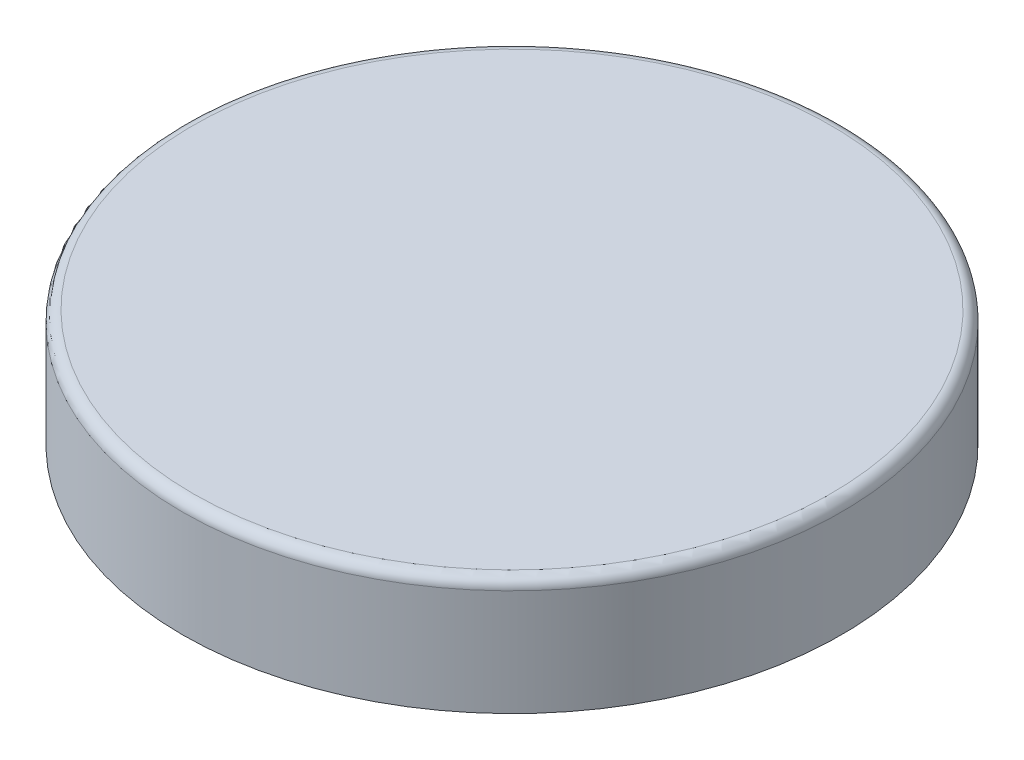
ISO-10303-21;
HEADER;
FILE_DESCRIPTION(('STEP AP214'),'2;1');
FILE_NAME('part.step','',(''),(''),'','','');
FILE_SCHEMA(('AUTOMOTIVE_DESIGN { 1 0 10303 214 1 1 1 1 }'));
ENDSEC;
DATA;
#1=APPLICATION_CONTEXT('core data for automotive mechanical design processes');
#2=APPLICATION_PROTOCOL_DEFINITION('international standard','automotive_design',2000,#1);
#3=PRODUCT_CONTEXT('',#1,'mechanical');
#4=PRODUCT('Part','Part','',(#3));
#5=PRODUCT_RELATED_PRODUCT_CATEGORY('part','',(#4));
#6=PRODUCT_DEFINITION_FORMATION('','',#4);
#7=PRODUCT_DEFINITION_CONTEXT('part definition',#1,'design');
#8=PRODUCT_DEFINITION('design','',#6,#7);
#9=PRODUCT_DEFINITION_SHAPE('','',#8);
#10=(LENGTH_UNIT() NAMED_UNIT(*) SI_UNIT(.MILLI.,.METRE.));
#11=(NAMED_UNIT(*) PLANE_ANGLE_UNIT() SI_UNIT($,.RADIAN.));
#12=(NAMED_UNIT(*) SI_UNIT($,.STERADIAN.) SOLID_ANGLE_UNIT());
#13=UNCERTAINTY_MEASURE_WITH_UNIT(LENGTH_MEASURE(1.E-05),#10,'distance_accuracy_value','');
#14=(GEOMETRIC_REPRESENTATION_CONTEXT(3) GLOBAL_UNCERTAINTY_ASSIGNED_CONTEXT((#13)) GLOBAL_UNIT_ASSIGNED_CONTEXT((#10,
#11,#12)) REPRESENTATION_CONTEXT('',''));
#15=CARTESIAN_POINT('',(0.,0.,0.));
#16=DIRECTION('',(0.,0.,1.));
#17=DIRECTION('',(1.,0.,0.));
#18=AXIS2_PLACEMENT_3D('',#15,#16,#17);
#19=CARTESIAN_POINT('',(0.,0.,0.));
#20=DIRECTION('',(0.,1.,0.));
#21=DIRECTION('',(0.,0.,1.));
#22=AXIS2_PLACEMENT_3D('',#19,#20,#21);
#23=PLANE('',#22);
#24=CARTESIAN_POINT('',(0.,0.,0.));
#25=DIRECTION('',(0.,1.,0.));
#26=DIRECTION('',(0.,0.,1.));
#27=AXIS2_PLACEMENT_3D('',#24,#25,#26);
#28=CIRCLE('',#27,31.);
#29=CARTESIAN_POINT('',(0.,0.,31.));
#30=VERTEX_POINT('',#29);
#31=EDGE_CURVE('E41',#30,#30,#28,.T.);
#32=ORIENTED_EDGE('',*,*,#31,.F.);
#33=EDGE_LOOP('',(#32));
#34=FACE_BOUND('',#33,.T.);
#35=CARTESIAN_POINT('',(0.,0.,0.));
#36=DIRECTION('',(0.,1.,0.));
#37=DIRECTION('',(0.,0.,1.));
#38=AXIS2_PLACEMENT_3D('',#35,#36,#37);
#39=CIRCLE('',#38,30.);
#40=CARTESIAN_POINT('',(0.,0.,30.));
#41=VERTEX_POINT('',#40);
#42=EDGE_CURVE('E45',#41,#41,#39,.T.);
#43=ORIENTED_EDGE('',*,*,#42,.T.);
#44=EDGE_LOOP('',(#43));
#45=FACE_BOUND('',#44,.T.);
#46=ADVANCED_FACE('F30',(#34,#45),#23,.F.);
#47=CARTESIAN_POINT('',(0.,10.,0.));
#48=DIRECTION('',(0.,-1.,0.));
#49=DIRECTION('',(0.,0.,-1.));
#50=AXIS2_PLACEMENT_3D('',#47,#48,#49);
#51=CYLINDRICAL_SURFACE('',#50,31.);
#52=CARTESIAN_POINT('',(0.,10.,0.));
#53=DIRECTION('',(0.,1.,0.));
#54=DIRECTION('',(0.,0.,1.));
#55=AXIS2_PLACEMENT_3D('',#52,#53,#54);
#56=CIRCLE('',#55,31.);
#57=CARTESIAN_POINT('',(0.,10.,31.));
#58=VERTEX_POINT('',#57);
#59=EDGE_CURVE('E10',#58,#58,#56,.F.);
#60=ORIENTED_EDGE('',*,*,#59,.T.);
#61=EDGE_LOOP('',(#60));
#62=FACE_BOUND('',#61,.T.);
#63=ORIENTED_EDGE('',*,*,#31,.T.);
#64=EDGE_LOOP('',(#63));
#65=FACE_BOUND('',#64,.T.);
#66=ADVANCED_FACE('F66',(#62,#65),#51,.T.);
#67=CARTESIAN_POINT('',(0.,10.,0.));
#68=DIRECTION('',(0.,-1.,0.));
#69=DIRECTION('',(0.,0.,-1.));
#70=AXIS2_PLACEMENT_3D('',#67,#68,#69);
#71=CYLINDRICAL_SURFACE('',#70,30.);
#72=CARTESIAN_POINT('',(0.,10.,0.));
#73=DIRECTION('',(0.,1.,0.));
#74=DIRECTION('',(0.,0.,1.));
#75=AXIS2_PLACEMENT_3D('',#72,#73,#74);
#76=CIRCLE('',#75,30.);
#77=CARTESIAN_POINT('',(0.,10.,30.));
#78=VERTEX_POINT('',#77);
#79=EDGE_CURVE('E50',#78,#78,#76,.T.);
#80=ORIENTED_EDGE('',*,*,#79,.T.);
#81=EDGE_LOOP('',(#80));
#82=FACE_BOUND('',#81,.T.);
#83=ORIENTED_EDGE('',*,*,#42,.F.);
#84=EDGE_LOOP('',(#83));
#85=FACE_BOUND('',#84,.T.);
#86=ADVANCED_FACE('F54',(#82,#85),#71,.F.);
#87=CARTESIAN_POINT('',(0.,10.,0.));
#88=DIRECTION('',(0.,1.,0.));
#89=DIRECTION('',(0.,0.,1.));
#90=AXIS2_PLACEMENT_3D('',#87,#88,#89);
#91=PLANE('',#90);
#92=ORIENTED_EDGE('',*,*,#79,.F.);
#93=EDGE_LOOP('',(#92));
#94=FACE_BOUND('',#93,.T.);
#95=ADVANCED_FACE('F57',(#94),#91,.F.);
#96=CARTESIAN_POINT('',(0.,11.,0.));
#97=DIRECTION('',(0.,1.,0.));
#98=DIRECTION('',(0.,0.,1.));
#99=AXIS2_PLACEMENT_3D('',#96,#97,#98);
#100=PLANE('',#99);
#101=CARTESIAN_POINT('',(0.,11.,0.));
#102=DIRECTION('',(0.,1.,0.));
#103=DIRECTION('',(0.,0.,1.));
#104=AXIS2_PLACEMENT_3D('',#101,#102,#103);
#105=CIRCLE('',#104,30.);
#106=CARTESIAN_POINT('',(0.,11.,30.));
#107=VERTEX_POINT('',#106);
#108=EDGE_CURVE('E37',#107,#107,#105,.T.);
#109=ORIENTED_EDGE('',*,*,#108,.T.);
#110=EDGE_LOOP('',(#109));
#111=FACE_BOUND('',#110,.T.);
#112=ADVANCED_FACE('F59',(#111),#100,.T.);
#113=CARTESIAN_POINT('',(0.,10.,0.));
#114=DIRECTION('',(0.,1.,0.));
#115=DIRECTION('',(0.,0.,1.));
#116=AXIS2_PLACEMENT_3D('',#113,#114,#115);
#117=TOROIDAL_SURFACE('',#116,30.,1.);
#118=ORIENTED_EDGE('',*,*,#59,.F.);
#119=EDGE_LOOP('',(#118));
#120=FACE_BOUND('',#119,.T.);
#121=ORIENTED_EDGE('',*,*,#108,.F.);
#122=EDGE_LOOP('',(#121));
#123=FACE_BOUND('',#122,.T.);
#124=ADVANCED_FACE('F32',(#120,#123),#117,.T.);
#125=CLOSED_SHELL('',(#46,#66,#86,#95,#112,#124));
#126=MANIFOLD_SOLID_BREP('B2',#125);
#127=ADVANCED_BREP_SHAPE_REPRESENTATION('',(#18,#126),#14);
#128=SHAPE_DEFINITION_REPRESENTATION(#9,#127);
ENDSEC;
END-ISO-10303-21;
